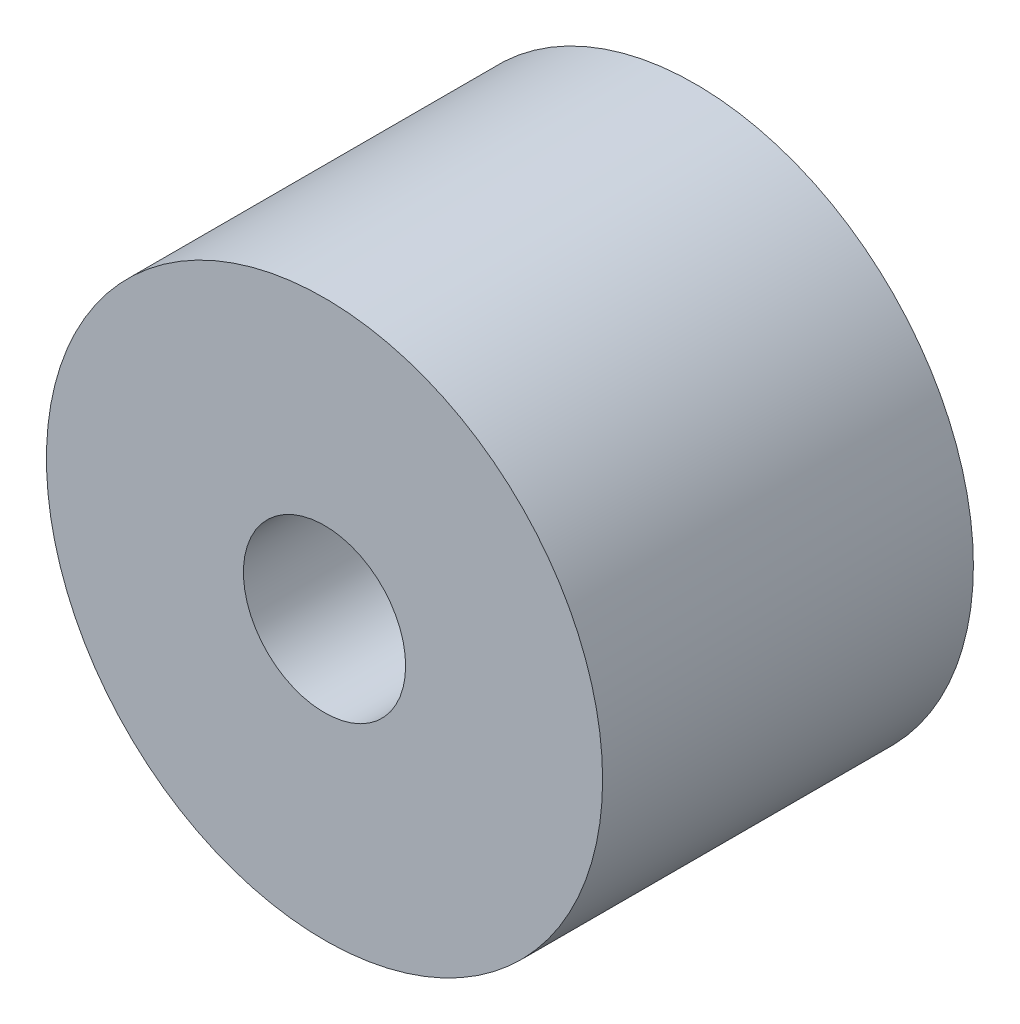
ISO-10303-21;
HEADER;
FILE_DESCRIPTION(('STEP AP214'),'2;1');
FILE_NAME('part.step','',(''),(''),'','','');
FILE_SCHEMA(('AUTOMOTIVE_DESIGN { 1 0 10303 214 1 1 1 1 }'));
ENDSEC;
DATA;
#1=APPLICATION_CONTEXT('core data for automotive mechanical design processes');
#2=APPLICATION_PROTOCOL_DEFINITION('international standard','automotive_design',2000,#1);
#3=PRODUCT_CONTEXT('',#1,'mechanical');
#4=PRODUCT('Part','Part','',(#3));
#5=PRODUCT_RELATED_PRODUCT_CATEGORY('part','',(#4));
#6=PRODUCT_DEFINITION_FORMATION('','',#4);
#7=PRODUCT_DEFINITION_CONTEXT('part definition',#1,'design');
#8=PRODUCT_DEFINITION('design','',#6,#7);
#9=PRODUCT_DEFINITION_SHAPE('','',#8);
#10=(LENGTH_UNIT() NAMED_UNIT(*) SI_UNIT(.MILLI.,.METRE.));
#11=(NAMED_UNIT(*) PLANE_ANGLE_UNIT() SI_UNIT($,.RADIAN.));
#12=(NAMED_UNIT(*) SI_UNIT($,.STERADIAN.) SOLID_ANGLE_UNIT());
#13=UNCERTAINTY_MEASURE_WITH_UNIT(LENGTH_MEASURE(1.E-05),#10,'distance_accuracy_value','');
#14=(GEOMETRIC_REPRESENTATION_CONTEXT(3) GLOBAL_UNCERTAINTY_ASSIGNED_CONTEXT((#13)) GLOBAL_UNIT_ASSIGNED_CONTEXT((#10,
#11,#12)) REPRESENTATION_CONTEXT('',''));
#15=CARTESIAN_POINT('',(0.,0.,0.));
#16=DIRECTION('',(0.,0.,1.));
#17=DIRECTION('',(1.,0.,0.));
#18=AXIS2_PLACEMENT_3D('',#15,#16,#17);
#19=CARTESIAN_POINT('',(0.,0.,12.7));
#20=DIRECTION('',(0.,0.,1.));
#21=DIRECTION('',(1.,0.,0.));
#22=AXIS2_PLACEMENT_3D('',#19,#20,#21);
#23=PLANE('',#22);
#24=CARTESIAN_POINT('',(0.,0.,12.7));
#25=DIRECTION('',(0.,0.,1.));
#26=DIRECTION('',(1.,0.,0.));
#27=AXIS2_PLACEMENT_3D('',#24,#25,#26);
#28=CIRCLE('',#27,19.05);
#29=CARTESIAN_POINT('',(19.05,0.,12.7));
#30=VERTEX_POINT('',#29);
#31=EDGE_CURVE('E10',#30,#30,#28,.T.);
#32=ORIENTED_EDGE('',*,*,#31,.T.);
#33=EDGE_LOOP('',(#32));
#34=FACE_BOUND('',#33,.T.);
#35=CARTESIAN_POINT('',(0.,0.,12.7));
#36=DIRECTION('',(0.,0.,1.));
#37=DIRECTION('',(1.,0.,0.));
#38=AXIS2_PLACEMENT_3D('',#35,#36,#37);
#39=CIRCLE('',#38,5.55625);
#40=CARTESIAN_POINT('',(5.55625,0.,12.7));
#41=VERTEX_POINT('',#40);
#42=EDGE_CURVE('E43',#41,#41,#39,.T.);
#43=ORIENTED_EDGE('',*,*,#42,.F.);
#44=EDGE_LOOP('',(#43));
#45=FACE_BOUND('',#44,.T.);
#46=ADVANCED_FACE('F32',(#34,#45),#23,.T.);
#47=CARTESIAN_POINT('',(0.,0.,-12.7));
#48=DIRECTION('',(0.,0.,1.));
#49=DIRECTION('',(1.,0.,0.));
#50=AXIS2_PLACEMENT_3D('',#47,#48,#49);
#51=PLANE('',#50);
#52=CARTESIAN_POINT('',(0.,0.,-12.7));
#53=DIRECTION('',(0.,0.,1.));
#54=DIRECTION('',(1.,0.,0.));
#55=AXIS2_PLACEMENT_3D('',#52,#53,#54);
#56=CIRCLE('',#55,19.05);
#57=CARTESIAN_POINT('',(19.05,0.,-12.7));
#58=VERTEX_POINT('',#57);
#59=EDGE_CURVE('E36',#58,#58,#56,.T.);
#60=ORIENTED_EDGE('',*,*,#59,.F.);
#61=EDGE_LOOP('',(#60));
#62=FACE_BOUND('',#61,.T.);
#63=CARTESIAN_POINT('',(0.,0.,-12.7));
#64=DIRECTION('',(0.,0.,1.));
#65=DIRECTION('',(1.,0.,0.));
#66=AXIS2_PLACEMENT_3D('',#63,#64,#65);
#67=CIRCLE('',#66,5.55625);
#68=CARTESIAN_POINT('',(5.55625,0.,-12.7));
#69=VERTEX_POINT('',#68);
#70=EDGE_CURVE('E45',#69,#69,#67,.T.);
#71=ORIENTED_EDGE('',*,*,#70,.T.);
#72=EDGE_LOOP('',(#71));
#73=FACE_BOUND('',#72,.T.);
#74=ADVANCED_FACE('F55',(#62,#73),#51,.F.);
#75=CARTESIAN_POINT('',(0.,0.,12.7));
#76=DIRECTION('',(0.,0.,-1.));
#77=DIRECTION('',(-1.,0.,0.));
#78=AXIS2_PLACEMENT_3D('',#75,#76,#77);
#79=CYLINDRICAL_SURFACE('',#78,19.05);
#80=ORIENTED_EDGE('',*,*,#31,.F.);
#81=EDGE_LOOP('',(#80));
#82=FACE_BOUND('',#81,.T.);
#83=ORIENTED_EDGE('',*,*,#59,.T.);
#84=EDGE_LOOP('',(#83));
#85=FACE_BOUND('',#84,.T.);
#86=ADVANCED_FACE('F34',(#82,#85),#79,.T.);
#87=CARTESIAN_POINT('',(0.,0.,12.7));
#88=DIRECTION('',(0.,0.,-1.));
#89=DIRECTION('',(-1.,0.,0.));
#90=AXIS2_PLACEMENT_3D('',#87,#88,#89);
#91=CYLINDRICAL_SURFACE('',#90,5.55625);
#92=ORIENTED_EDGE('',*,*,#42,.T.);
#93=EDGE_LOOP('',(#92));
#94=FACE_BOUND('',#93,.T.);
#95=ORIENTED_EDGE('',*,*,#70,.F.);
#96=EDGE_LOOP('',(#95));
#97=FACE_BOUND('',#96,.T.);
#98=ADVANCED_FACE('F51',(#94,#97),#91,.F.);
#99=CLOSED_SHELL('',(#46,#74,#86,#98));
#100=MANIFOLD_SOLID_BREP('B2',#99);
#101=ADVANCED_BREP_SHAPE_REPRESENTATION('',(#18,#100),#14);
#102=SHAPE_DEFINITION_REPRESENTATION(#9,#101);
ENDSEC;
END-ISO-10303-21;
